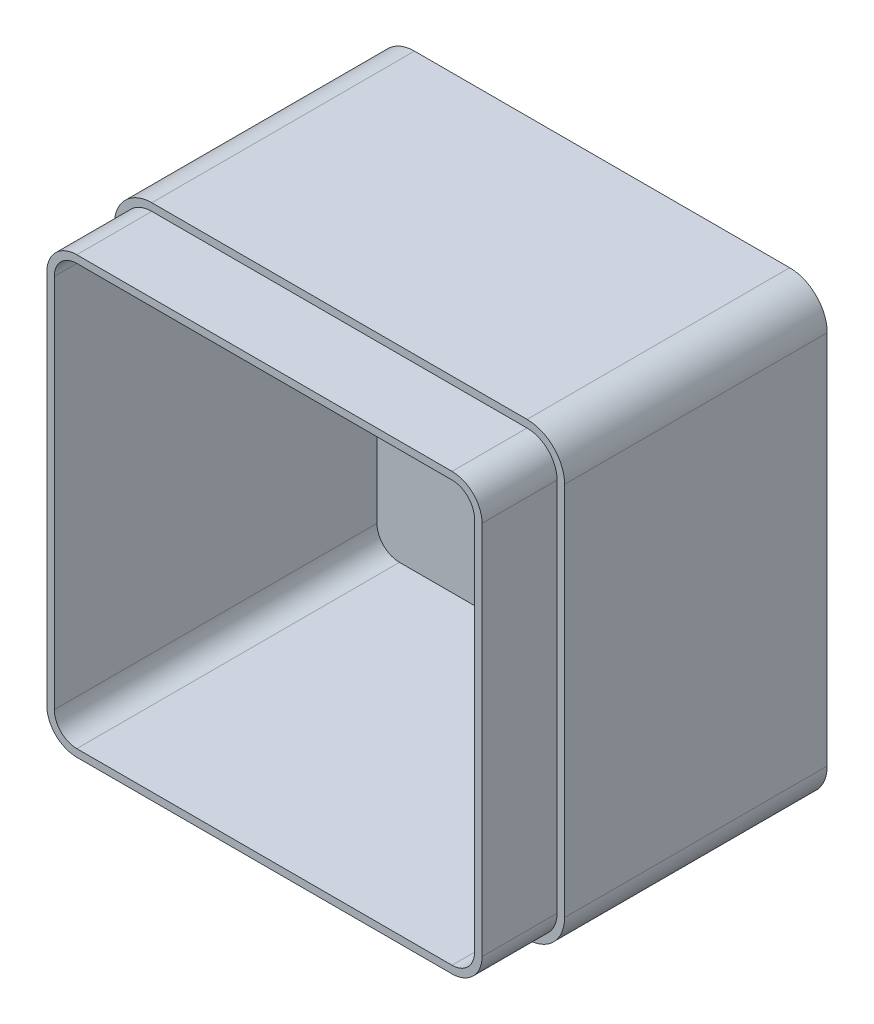
ISO-10303-21;
HEADER;
FILE_DESCRIPTION(('STEP AP214'),'2;1');
FILE_NAME('part.step','',(''),(''),'','','');
FILE_SCHEMA(('AUTOMOTIVE_DESIGN { 1 0 10303 214 1 1 1 1 }'));
ENDSEC;
DATA;
#1=APPLICATION_CONTEXT('core data for automotive mechanical design processes');
#2=APPLICATION_PROTOCOL_DEFINITION('international standard','automotive_design',2000,#1);
#3=PRODUCT_CONTEXT('',#1,'mechanical');
#4=PRODUCT('Part','Part','',(#3));
#5=PRODUCT_RELATED_PRODUCT_CATEGORY('part','',(#4));
#6=PRODUCT_DEFINITION_FORMATION('','',#4);
#7=PRODUCT_DEFINITION_CONTEXT('part definition',#1,'design');
#8=PRODUCT_DEFINITION('design','',#6,#7);
#9=PRODUCT_DEFINITION_SHAPE('','',#8);
#10=(LENGTH_UNIT() NAMED_UNIT(*) SI_UNIT(.MILLI.,.METRE.));
#11=(NAMED_UNIT(*) PLANE_ANGLE_UNIT() SI_UNIT($,.RADIAN.));
#12=(NAMED_UNIT(*) SI_UNIT($,.STERADIAN.) SOLID_ANGLE_UNIT());
#13=UNCERTAINTY_MEASURE_WITH_UNIT(LENGTH_MEASURE(1.E-05),#10,'distance_accuracy_value','');
#14=(GEOMETRIC_REPRESENTATION_CONTEXT(3) GLOBAL_UNCERTAINTY_ASSIGNED_CONTEXT((#13)) GLOBAL_UNIT_ASSIGNED_CONTEXT((#10,
#11,#12)) REPRESENTATION_CONTEXT('',''));
#15=CARTESIAN_POINT('',(0.,0.,0.));
#16=DIRECTION('',(0.,0.,1.));
#17=DIRECTION('',(1.,0.,0.));
#18=AXIS2_PLACEMENT_3D('',#15,#16,#17);
#19=CARTESIAN_POINT('',(0.,0.,90.));
#20=DIRECTION('',(0.,0.,-1.));
#21=DIRECTION('',(-1.,0.,0.));
#22=AXIS2_PLACEMENT_3D('',#19,#20,#21);
#23=PLANE('',#22);
#24=DIRECTION('',(0.,-1.,0.));
#25=VECTOR('',#24,1.);
#26=CARTESIAN_POINT('',(4.,0.,90.));
#27=LINE('',#26,#25);
#28=CARTESIAN_POINT('',(4.,110.,90.));
#29=VERTEX_POINT('',#28);
#30=CARTESIAN_POINT('',(4.,9.99999999999999,90.));
#31=VERTEX_POINT('',#30);
#32=EDGE_CURVE('E368',#29,#31,#27,.T.);
#33=ORIENTED_EDGE('',*,*,#32,.F.);
#34=CARTESIAN_POINT('',(9.99999999999999,110.,90.));
#35=DIRECTION('',(0.,0.,-1.));
#36=DIRECTION('',(-1.,0.,0.));
#37=AXIS2_PLACEMENT_3D('',#34,#35,#36);
#38=CIRCLE('',#37,6.);
#39=CARTESIAN_POINT('',(9.99999999999999,116.,90.));
#40=VERTEX_POINT('',#39);
#41=EDGE_CURVE('E414',#40,#29,#38,.F.);
#42=ORIENTED_EDGE('',*,*,#41,.F.);
#43=DIRECTION('',(-1.,0.,0.));
#44=VECTOR('',#43,1.);
#45=CARTESIAN_POINT('',(0.,116.,90.));
#46=LINE('',#45,#44);
#47=CARTESIAN_POINT('',(110.,116.,90.));
#48=VERTEX_POINT('',#47);
#49=EDGE_CURVE('E383',#48,#40,#46,.T.);
#50=ORIENTED_EDGE('',*,*,#49,.F.);
#51=CARTESIAN_POINT('',(110.,110.,90.));
#52=DIRECTION('',(0.,0.,-1.));
#53=DIRECTION('',(-1.,0.,0.));
#54=AXIS2_PLACEMENT_3D('',#51,#52,#53);
#55=CIRCLE('',#54,6.);
#56=CARTESIAN_POINT('',(116.,110.,90.));
#57=VERTEX_POINT('',#56);
#58=EDGE_CURVE('E347',#57,#48,#55,.F.);
#59=ORIENTED_EDGE('',*,*,#58,.F.);
#60=DIRECTION('',(0.,1.,0.));
#61=VECTOR('',#60,1.);
#62=CARTESIAN_POINT('',(116.,0.,90.));
#63=LINE('',#62,#61);
#64=CARTESIAN_POINT('',(116.,9.99999999999999,90.));
#65=VERTEX_POINT('',#64);
#66=EDGE_CURVE('E411',#65,#57,#63,.T.);
#67=ORIENTED_EDGE('',*,*,#66,.F.);
#68=CARTESIAN_POINT('',(110.,10.,90.));
#69=DIRECTION('',(0.,0.,-1.));
#70=DIRECTION('',(-1.,0.,0.));
#71=AXIS2_PLACEMENT_3D('',#68,#69,#70);
#72=CIRCLE('',#71,6.);
#73=CARTESIAN_POINT('',(110.,4.,90.));
#74=VERTEX_POINT('',#73);
#75=EDGE_CURVE('E407',#74,#65,#72,.F.);
#76=ORIENTED_EDGE('',*,*,#75,.F.);
#77=DIRECTION('',(1.,0.,0.));
#78=VECTOR('',#77,1.);
#79=CARTESIAN_POINT('',(0.,4.,90.));
#80=LINE('',#79,#78);
#81=CARTESIAN_POINT('',(9.99999999999999,4.,90.));
#82=VERTEX_POINT('',#81);
#83=EDGE_CURVE('E404',#82,#74,#80,.T.);
#84=ORIENTED_EDGE('',*,*,#83,.F.);
#85=CARTESIAN_POINT('',(9.99999999999999,10.,90.));
#86=DIRECTION('',(0.,0.,-1.));
#87=DIRECTION('',(-1.,0.,0.));
#88=AXIS2_PLACEMENT_3D('',#85,#86,#87);
#89=CIRCLE('',#88,6.);
#90=EDGE_CURVE('E392',#31,#82,#89,.F.);
#91=ORIENTED_EDGE('',*,*,#90,.F.);
#92=EDGE_LOOP('',(#33,#42,#50,#59,#67,#76,#84,#91));
#93=FACE_BOUND('',#92,.T.);
#94=CARTESIAN_POINT('',(9.99999999999999,110.,90.));
#95=DIRECTION('',(0.,0.,1.));
#96=DIRECTION('',(1.,0.,0.));
#97=AXIS2_PLACEMENT_3D('',#94,#95,#96);
#98=CIRCLE('',#97,8.);
#99=CARTESIAN_POINT('',(9.99999999999999,118.,90.));
#100=VERTEX_POINT('',#99);
#101=CARTESIAN_POINT('',(2.,110.,90.));
#102=VERTEX_POINT('',#101);
#103=EDGE_CURVE('E275',#100,#102,#98,.T.);
#104=ORIENTED_EDGE('',*,*,#103,.T.);
#105=DIRECTION('',(0.,-1.,0.));
#106=VECTOR('',#105,1.);
#107=CARTESIAN_POINT('',(2.,110.,90.));
#108=LINE('',#107,#106);
#109=CARTESIAN_POINT('',(2.,9.99999999999999,90.));
#110=VERTEX_POINT('',#109);
#111=EDGE_CURVE('E223',#102,#110,#108,.T.);
#112=ORIENTED_EDGE('',*,*,#111,.T.);
#113=CARTESIAN_POINT('',(9.99999999999999,10.,90.));
#114=DIRECTION('',(0.,0.,1.));
#115=DIRECTION('',(1.,0.,0.));
#116=AXIS2_PLACEMENT_3D('',#113,#114,#115);
#117=CIRCLE('',#116,8.);
#118=CARTESIAN_POINT('',(9.99999999999999,2.,90.));
#119=VERTEX_POINT('',#118);
#120=EDGE_CURVE('E71',#110,#119,#117,.T.);
#121=ORIENTED_EDGE('',*,*,#120,.T.);
#122=DIRECTION('',(1.,0.,0.));
#123=VECTOR('',#122,1.);
#124=CARTESIAN_POINT('',(9.99999999999999,2.,90.));
#125=LINE('',#124,#123);
#126=CARTESIAN_POINT('',(110.,2.,90.));
#127=VERTEX_POINT('',#126);
#128=EDGE_CURVE('E282',#119,#127,#125,.T.);
#129=ORIENTED_EDGE('',*,*,#128,.T.);
#130=CARTESIAN_POINT('',(110.,10.,90.));
#131=DIRECTION('',(0.,0.,1.));
#132=DIRECTION('',(1.,0.,0.));
#133=AXIS2_PLACEMENT_3D('',#130,#131,#132);
#134=CIRCLE('',#133,7.99999999999999);
#135=CARTESIAN_POINT('',(118.,10.,90.));
#136=VERTEX_POINT('',#135);
#137=EDGE_CURVE('E286',#127,#136,#134,.T.);
#138=ORIENTED_EDGE('',*,*,#137,.T.);
#139=DIRECTION('',(0.,1.,0.));
#140=VECTOR('',#139,1.);
#141=CARTESIAN_POINT('',(118.,9.99999999999999,90.));
#142=LINE('',#141,#140);
#143=CARTESIAN_POINT('',(118.,110.,90.));
#144=VERTEX_POINT('',#143);
#145=EDGE_CURVE('E290',#136,#144,#142,.T.);
#146=ORIENTED_EDGE('',*,*,#145,.T.);
#147=CARTESIAN_POINT('',(110.,110.,90.));
#148=DIRECTION('',(0.,0.,1.));
#149=DIRECTION('',(1.,0.,0.));
#150=AXIS2_PLACEMENT_3D('',#147,#148,#149);
#151=CIRCLE('',#150,7.99999999999999);
#152=CARTESIAN_POINT('',(110.,118.,90.));
#153=VERTEX_POINT('',#152);
#154=EDGE_CURVE('E252',#144,#153,#151,.T.);
#155=ORIENTED_EDGE('',*,*,#154,.T.);
#156=DIRECTION('',(-1.,0.,0.));
#157=VECTOR('',#156,1.);
#158=CARTESIAN_POINT('',(110.,118.,90.));
#159=LINE('',#158,#157);
#160=EDGE_CURVE('E246',#153,#100,#159,.T.);
#161=ORIENTED_EDGE('',*,*,#160,.T.);
#162=EDGE_LOOP('',(#104,#112,#121,#129,#138,#146,#155,#161));
#163=FACE_BOUND('',#162,.T.);
#164=ADVANCED_FACE('F55',(#93,#163),#23,.F.);
#165=CARTESIAN_POINT('',(4.,0.,90.));
#166=DIRECTION('',(1.,0.,0.));
#167=DIRECTION('',(0.,0.,-1.));
#168=AXIS2_PLACEMENT_3D('',#165,#166,#167);
#169=PLANE('',#168);
#170=DIRECTION('',(0.,-1.,0.));
#171=VECTOR('',#170,1.);
#172=CARTESIAN_POINT('',(4.,0.,4.));
#173=LINE('',#172,#171);
#174=CARTESIAN_POINT('',(4.,110.,4.));
#175=VERTEX_POINT('',#174);
#176=CARTESIAN_POINT('',(4.,9.99999999999999,4.));
#177=VERTEX_POINT('',#176);
#178=EDGE_CURVE('E339',#175,#177,#173,.T.);
#179=ORIENTED_EDGE('',*,*,#178,.F.);
#180=DIRECTION('',(0.,0.,-1.));
#181=VECTOR('',#180,1.);
#182=CARTESIAN_POINT('',(4.,110.,90.));
#183=LINE('',#182,#181);
#184=EDGE_CURVE('E348',#29,#175,#183,.T.);
#185=ORIENTED_EDGE('',*,*,#184,.F.);
#186=ORIENTED_EDGE('',*,*,#32,.T.);
#187=DIRECTION('',(0.,0.,-1.));
#188=VECTOR('',#187,1.);
#189=CARTESIAN_POINT('',(4.,9.99999999999999,90.));
#190=LINE('',#189,#188);
#191=EDGE_CURVE('E344',#177,#31,#190,.F.);
#192=ORIENTED_EDGE('',*,*,#191,.F.);
#193=EDGE_LOOP('',(#179,#185,#186,#192));
#194=FACE_BOUND('',#193,.T.);
#195=ADVANCED_FACE('F526',(#194),#169,.T.);
#196=CARTESIAN_POINT('',(0.,4.,90.));
#197=DIRECTION('',(0.,1.,0.));
#198=DIRECTION('',(0.,0.,1.));
#199=AXIS2_PLACEMENT_3D('',#196,#197,#198);
#200=PLANE('',#199);
#201=ORIENTED_EDGE('',*,*,#83,.T.);
#202=DIRECTION('',(0.,0.,1.));
#203=VECTOR('',#202,1.);
#204=CARTESIAN_POINT('',(110.,4.,90.));
#205=LINE('',#204,#203);
#206=CARTESIAN_POINT('',(110.,4.,4.));
#207=VERTEX_POINT('',#206);
#208=EDGE_CURVE('E380',#207,#74,#205,.T.);
#209=ORIENTED_EDGE('',*,*,#208,.F.);
#210=DIRECTION('',(1.,0.,0.));
#211=VECTOR('',#210,1.);
#212=CARTESIAN_POINT('',(0.,4.,4.));
#213=LINE('',#212,#211);
#214=CARTESIAN_POINT('',(9.99999999999999,4.,4.));
#215=VERTEX_POINT('',#214);
#216=EDGE_CURVE('E343',#215,#207,#213,.T.);
#217=ORIENTED_EDGE('',*,*,#216,.F.);
#218=DIRECTION('',(0.,0.,1.));
#219=VECTOR('',#218,1.);
#220=CARTESIAN_POINT('',(9.99999999999999,4.,90.));
#221=LINE('',#220,#219);
#222=EDGE_CURVE('E371',#82,#215,#221,.F.);
#223=ORIENTED_EDGE('',*,*,#222,.F.);
#224=EDGE_LOOP('',(#201,#209,#217,#223));
#225=FACE_BOUND('',#224,.T.);
#226=ADVANCED_FACE('F532',(#225),#200,.T.);
#227=CARTESIAN_POINT('',(116.,0.,90.));
#228=DIRECTION('',(-1.,0.,0.));
#229=DIRECTION('',(0.,0.,1.));
#230=AXIS2_PLACEMENT_3D('',#227,#228,#229);
#231=PLANE('',#230);
#232=ORIENTED_EDGE('',*,*,#66,.T.);
#233=DIRECTION('',(0.,0.,1.));
#234=VECTOR('',#233,1.);
#235=CARTESIAN_POINT('',(116.,110.,90.));
#236=LINE('',#235,#234);
#237=CARTESIAN_POINT('',(116.,110.,4.));
#238=VERTEX_POINT('',#237);
#239=EDGE_CURVE('E389',#238,#57,#236,.T.);
#240=ORIENTED_EDGE('',*,*,#239,.F.);
#241=DIRECTION('',(0.,1.,0.));
#242=VECTOR('',#241,1.);
#243=CARTESIAN_POINT('',(116.,0.,4.));
#244=LINE('',#243,#242);
#245=CARTESIAN_POINT('',(116.,9.99999999999999,4.));
#246=VERTEX_POINT('',#245);
#247=EDGE_CURVE('E356',#246,#238,#244,.T.);
#248=ORIENTED_EDGE('',*,*,#247,.F.);
#249=DIRECTION('',(0.,0.,1.));
#250=VECTOR('',#249,1.);
#251=CARTESIAN_POINT('',(116.,9.99999999999999,90.));
#252=LINE('',#251,#250);
#253=EDGE_CURVE('E384',#65,#246,#252,.F.);
#254=ORIENTED_EDGE('',*,*,#253,.F.);
#255=EDGE_LOOP('',(#232,#240,#248,#254));
#256=FACE_BOUND('',#255,.T.);
#257=ADVANCED_FACE('F629',(#256),#231,.T.);
#258=CARTESIAN_POINT('',(0.,116.,90.));
#259=DIRECTION('',(0.,-1.,0.));
#260=DIRECTION('',(0.,0.,-1.));
#261=AXIS2_PLACEMENT_3D('',#258,#259,#260);
#262=PLANE('',#261);
#263=DIRECTION('',(-1.,0.,0.));
#264=VECTOR('',#263,1.);
#265=CARTESIAN_POINT('',(0.,116.,4.));
#266=LINE('',#265,#264);
#267=CARTESIAN_POINT('',(110.,116.,4.));
#268=VERTEX_POINT('',#267);
#269=CARTESIAN_POINT('',(9.99999999999999,116.,4.));
#270=VERTEX_POINT('',#269);
#271=EDGE_CURVE('E364',#268,#270,#266,.T.);
#272=ORIENTED_EDGE('',*,*,#271,.F.);
#273=DIRECTION('',(0.,0.,-1.));
#274=VECTOR('',#273,1.);
#275=CARTESIAN_POINT('',(110.,116.,90.));
#276=LINE('',#275,#274);
#277=EDGE_CURVE('E388',#48,#268,#276,.T.);
#278=ORIENTED_EDGE('',*,*,#277,.F.);
#279=ORIENTED_EDGE('',*,*,#49,.T.);
#280=DIRECTION('',(0.,0.,-1.));
#281=VECTOR('',#280,1.);
#282=CARTESIAN_POINT('',(9.99999999999999,116.,90.));
#283=LINE('',#282,#281);
#284=EDGE_CURVE('E396',#270,#40,#283,.F.);
#285=ORIENTED_EDGE('',*,*,#284,.F.);
#286=EDGE_LOOP('',(#272,#278,#279,#285));
#287=FACE_BOUND('',#286,.T.);
#288=ADVANCED_FACE('F633',(#287),#262,.T.);
#289=CARTESIAN_POINT('',(0.,0.,4.));
#290=DIRECTION('',(0.,0.,-1.));
#291=DIRECTION('',(-1.,0.,0.));
#292=AXIS2_PLACEMENT_3D('',#289,#290,#291);
#293=PLANE('',#292);
#294=ORIENTED_EDGE('',*,*,#216,.T.);
#295=CARTESIAN_POINT('',(110.,10.,4.));
#296=DIRECTION('',(0.,0.,-1.));
#297=DIRECTION('',(-1.,0.,0.));
#298=AXIS2_PLACEMENT_3D('',#295,#296,#297);
#299=CIRCLE('',#298,6.);
#300=EDGE_CURVE('E359',#246,#207,#299,.T.);
#301=ORIENTED_EDGE('',*,*,#300,.F.);
#302=ORIENTED_EDGE('',*,*,#247,.T.);
#303=CARTESIAN_POINT('',(110.,110.,4.));
#304=DIRECTION('',(0.,0.,-1.));
#305=DIRECTION('',(-1.,0.,0.));
#306=AXIS2_PLACEMENT_3D('',#303,#304,#305);
#307=CIRCLE('',#306,6.);
#308=EDGE_CURVE('E363',#268,#238,#307,.T.);
#309=ORIENTED_EDGE('',*,*,#308,.F.);
#310=ORIENTED_EDGE('',*,*,#271,.T.);
#311=CARTESIAN_POINT('',(9.99999999999999,110.,4.));
#312=DIRECTION('',(0.,0.,-1.));
#313=DIRECTION('',(-1.,0.,0.));
#314=AXIS2_PLACEMENT_3D('',#311,#312,#313);
#315=CIRCLE('',#314,6.);
#316=EDGE_CURVE('E360',#175,#270,#315,.T.);
#317=ORIENTED_EDGE('',*,*,#316,.F.);
#318=ORIENTED_EDGE('',*,*,#178,.T.);
#319=CARTESIAN_POINT('',(9.99999999999999,10.,4.));
#320=DIRECTION('',(0.,0.,-1.));
#321=DIRECTION('',(-1.,0.,0.));
#322=AXIS2_PLACEMENT_3D('',#319,#320,#321);
#323=CIRCLE('',#322,6.);
#324=EDGE_CURVE('E352',#215,#177,#323,.T.);
#325=ORIENTED_EDGE('',*,*,#324,.F.);
#326=EDGE_LOOP('',(#294,#301,#302,#309,#310,#317,#318,#325));
#327=FACE_BOUND('',#326,.T.);
#328=ADVANCED_FACE('F637',(#327),#293,.F.);
#329=CARTESIAN_POINT('',(9.99999999999999,10.,90.));
#330=DIRECTION('',(0.,0.,-1.));
#331=DIRECTION('',(-1.,0.,0.));
#332=AXIS2_PLACEMENT_3D('',#329,#330,#331);
#333=CYLINDRICAL_SURFACE('',#332,6.);
#334=ORIENTED_EDGE('',*,*,#90,.T.);
#335=ORIENTED_EDGE('',*,*,#222,.T.);
#336=ORIENTED_EDGE('',*,*,#324,.T.);
#337=ORIENTED_EDGE('',*,*,#191,.T.);
#338=EDGE_LOOP('',(#334,#335,#336,#337));
#339=FACE_BOUND('',#338,.T.);
#340=ADVANCED_FACE('F641',(#339),#333,.F.);
#341=CARTESIAN_POINT('',(110.,10.,90.));
#342=DIRECTION('',(0.,0.,-1.));
#343=DIRECTION('',(-1.,0.,0.));
#344=AXIS2_PLACEMENT_3D('',#341,#342,#343);
#345=CYLINDRICAL_SURFACE('',#344,6.);
#346=ORIENTED_EDGE('',*,*,#75,.T.);
#347=ORIENTED_EDGE('',*,*,#253,.T.);
#348=ORIENTED_EDGE('',*,*,#300,.T.);
#349=ORIENTED_EDGE('',*,*,#208,.T.);
#350=EDGE_LOOP('',(#346,#347,#348,#349));
#351=FACE_BOUND('',#350,.T.);
#352=ADVANCED_FACE('F645',(#351),#345,.F.);
#353=CARTESIAN_POINT('',(9.99999999999999,110.,90.));
#354=DIRECTION('',(0.,0.,-1.));
#355=DIRECTION('',(-1.,0.,0.));
#356=AXIS2_PLACEMENT_3D('',#353,#354,#355);
#357=CYLINDRICAL_SURFACE('',#356,6.);
#358=ORIENTED_EDGE('',*,*,#41,.T.);
#359=ORIENTED_EDGE('',*,*,#184,.T.);
#360=ORIENTED_EDGE('',*,*,#316,.T.);
#361=ORIENTED_EDGE('',*,*,#284,.T.);
#362=EDGE_LOOP('',(#358,#359,#360,#361));
#363=FACE_BOUND('',#362,.T.);
#364=ADVANCED_FACE('F648',(#363),#357,.F.);
#365=CARTESIAN_POINT('',(110.,110.,90.));
#366=DIRECTION('',(0.,0.,-1.));
#367=DIRECTION('',(-1.,0.,0.));
#368=AXIS2_PLACEMENT_3D('',#365,#366,#367);
#369=CYLINDRICAL_SURFACE('',#368,6.);
#370=ORIENTED_EDGE('',*,*,#58,.T.);
#371=ORIENTED_EDGE('',*,*,#277,.T.);
#372=ORIENTED_EDGE('',*,*,#308,.T.);
#373=ORIENTED_EDGE('',*,*,#239,.T.);
#374=EDGE_LOOP('',(#370,#371,#372,#373));
#375=FACE_BOUND('',#374,.T.);
#376=ADVANCED_FACE('F539',(#375),#369,.F.);
#377=CARTESIAN_POINT('',(9.99999999999999,110.,70.));
#378=DIRECTION('',(0.,0.,1.));
#379=DIRECTION('',(1.,0.,0.));
#380=AXIS2_PLACEMENT_3D('',#377,#378,#379);
#381=PLANE('',#380);
#382=DIRECTION('',(-1.,0.,0.));
#383=VECTOR('',#382,1.);
#384=CARTESIAN_POINT('',(110.,118.,70.));
#385=LINE('',#384,#383);
#386=CARTESIAN_POINT('',(110.,118.,70.));
#387=VERTEX_POINT('',#386);
#388=CARTESIAN_POINT('',(9.99999999999999,118.,70.));
#389=VERTEX_POINT('',#388);
#390=EDGE_CURVE('E230',#387,#389,#385,.T.);
#391=ORIENTED_EDGE('',*,*,#390,.F.);
#392=CARTESIAN_POINT('',(110.,110.,70.));
#393=DIRECTION('',(0.,0.,1.));
#394=DIRECTION('',(1.,0.,0.));
#395=AXIS2_PLACEMENT_3D('',#392,#393,#394);
#396=CIRCLE('',#395,7.99999999999999);
#397=CARTESIAN_POINT('',(118.,110.,70.));
#398=VERTEX_POINT('',#397);
#399=EDGE_CURVE('E269',#398,#387,#396,.T.);
#400=ORIENTED_EDGE('',*,*,#399,.F.);
#401=DIRECTION('',(0.,1.,0.));
#402=VECTOR('',#401,1.);
#403=CARTESIAN_POINT('',(118.,9.99999999999999,70.));
#404=LINE('',#403,#402);
#405=CARTESIAN_POINT('',(118.,10.,70.));
#406=VERTEX_POINT('',#405);
#407=EDGE_CURVE('E265',#406,#398,#404,.T.);
#408=ORIENTED_EDGE('',*,*,#407,.F.);
#409=CARTESIAN_POINT('',(110.,10.,70.));
#410=DIRECTION('',(0.,0.,1.));
#411=DIRECTION('',(1.,0.,0.));
#412=AXIS2_PLACEMENT_3D('',#409,#410,#411);
#413=CIRCLE('',#412,7.99999999999999);
#414=CARTESIAN_POINT('',(110.,2.,70.));
#415=VERTEX_POINT('',#414);
#416=EDGE_CURVE('E261',#415,#406,#413,.T.);
#417=ORIENTED_EDGE('',*,*,#416,.F.);
#418=DIRECTION('',(1.,0.,0.));
#419=VECTOR('',#418,1.);
#420=CARTESIAN_POINT('',(9.99999999999999,2.,70.));
#421=LINE('',#420,#419);
#422=CARTESIAN_POINT('',(9.99999999999999,2.,70.));
#423=VERTEX_POINT('',#422);
#424=EDGE_CURVE('E257',#423,#415,#421,.T.);
#425=ORIENTED_EDGE('',*,*,#424,.F.);
#426=CARTESIAN_POINT('',(9.99999999999999,10.,70.));
#427=DIRECTION('',(0.,0.,1.));
#428=DIRECTION('',(1.,0.,0.));
#429=AXIS2_PLACEMENT_3D('',#426,#427,#428);
#430=CIRCLE('',#429,8.);
#431=CARTESIAN_POINT('',(2.,9.99999999999999,70.));
#432=VERTEX_POINT('',#431);
#433=EDGE_CURVE('E240',#432,#423,#430,.T.);
#434=ORIENTED_EDGE('',*,*,#433,.F.);
#435=DIRECTION('',(0.,-1.,0.));
#436=VECTOR('',#435,1.);
#437=CARTESIAN_POINT('',(2.,110.,70.));
#438=LINE('',#437,#436);
#439=CARTESIAN_POINT('',(2.,110.,70.));
#440=VERTEX_POINT('',#439);
#441=EDGE_CURVE('E221',#440,#432,#438,.T.);
#442=ORIENTED_EDGE('',*,*,#441,.F.);
#443=CARTESIAN_POINT('',(9.99999999999999,110.,70.));
#444=DIRECTION('',(0.,0.,1.));
#445=DIRECTION('',(1.,0.,0.));
#446=AXIS2_PLACEMENT_3D('',#443,#444,#445);
#447=CIRCLE('',#446,8.);
#448=EDGE_CURVE('E236',#389,#440,#447,.T.);
#449=ORIENTED_EDGE('',*,*,#448,.F.);
#450=EDGE_LOOP('',(#391,#400,#408,#417,#425,#434,#442,#449));
#451=FACE_BOUND('',#450,.T.);
#452=CARTESIAN_POINT('',(9.99999999999999,110.,70.));
#453=DIRECTION('',(0.,0.,1.));
#454=DIRECTION('',(1.,0.,0.));
#455=AXIS2_PLACEMENT_3D('',#452,#453,#454);
#456=CIRCLE('',#455,10.);
#457=CARTESIAN_POINT('',(9.99999999999999,120.,70.));
#458=VERTEX_POINT('',#457);
#459=CARTESIAN_POINT('',(0.,110.,70.));
#460=VERTEX_POINT('',#459);
#461=EDGE_CURVE('E299',#458,#460,#456,.T.);
#462=ORIENTED_EDGE('',*,*,#461,.T.);
#463=DIRECTION('',(0.,-1.,0.));
#464=VECTOR('',#463,1.);
#465=CARTESIAN_POINT('',(0.,110.,70.));
#466=LINE('',#465,#464);
#467=CARTESIAN_POINT('',(0.,10.,70.));
#468=VERTEX_POINT('',#467);
#469=EDGE_CURVE('E319',#460,#468,#466,.T.);
#470=ORIENTED_EDGE('',*,*,#469,.T.);
#471=CARTESIAN_POINT('',(9.99999999999999,10.,70.));
#472=DIRECTION('',(0.,0.,1.));
#473=DIRECTION('',(1.,0.,0.));
#474=AXIS2_PLACEMENT_3D('',#471,#472,#473);
#475=CIRCLE('',#474,10.);
#476=CARTESIAN_POINT('',(9.99999999999999,0.,70.));
#477=VERTEX_POINT('',#476);
#478=EDGE_CURVE('E322',#468,#477,#475,.T.);
#479=ORIENTED_EDGE('',*,*,#478,.T.);
#480=DIRECTION('',(1.,0.,0.));
#481=VECTOR('',#480,1.);
#482=CARTESIAN_POINT('',(9.99999999999999,0.,70.));
#483=LINE('',#482,#481);
#484=CARTESIAN_POINT('',(110.,0.,70.));
#485=VERTEX_POINT('',#484);
#486=EDGE_CURVE('E325',#477,#485,#483,.T.);
#487=ORIENTED_EDGE('',*,*,#486,.T.);
#488=CARTESIAN_POINT('',(110.,10.,70.));
#489=DIRECTION('',(0.,0.,1.));
#490=DIRECTION('',(1.,0.,0.));
#491=AXIS2_PLACEMENT_3D('',#488,#489,#490);
#492=CIRCLE('',#491,9.99999999999999);
#493=CARTESIAN_POINT('',(120.,10.,70.));
#494=VERTEX_POINT('',#493);
#495=EDGE_CURVE('E328',#485,#494,#492,.T.);
#496=ORIENTED_EDGE('',*,*,#495,.T.);
#497=DIRECTION('',(0.,1.,0.));
#498=VECTOR('',#497,1.);
#499=CARTESIAN_POINT('',(120.,10.,70.));
#500=LINE('',#499,#498);
#501=CARTESIAN_POINT('',(120.,110.,70.));
#502=VERTEX_POINT('',#501);
#503=EDGE_CURVE('E79',#494,#502,#500,.T.);
#504=ORIENTED_EDGE('',*,*,#503,.T.);
#505=CARTESIAN_POINT('',(110.,110.,70.));
#506=DIRECTION('',(0.,0.,1.));
#507=DIRECTION('',(1.,0.,0.));
#508=AXIS2_PLACEMENT_3D('',#505,#506,#507);
#509=CIRCLE('',#508,9.99999999999999);
#510=CARTESIAN_POINT('',(110.,120.,70.));
#511=VERTEX_POINT('',#510);
#512=EDGE_CURVE('E333',#502,#511,#509,.T.);
#513=ORIENTED_EDGE('',*,*,#512,.T.);
#514=DIRECTION('',(-1.,0.,0.));
#515=VECTOR('',#514,1.);
#516=CARTESIAN_POINT('',(110.,120.,70.));
#517=LINE('',#516,#515);
#518=EDGE_CURVE('E336',#511,#458,#517,.T.);
#519=ORIENTED_EDGE('',*,*,#518,.T.);
#520=EDGE_LOOP('',(#462,#470,#479,#487,#496,#504,#513,#519));
#521=FACE_BOUND('',#520,.T.);
#522=ADVANCED_FACE('F235',(#451,#521),#381,.T.);
#523=CARTESIAN_POINT('',(9.99999999999999,110.,70.));
#524=DIRECTION('',(0.,0.,1.));
#525=DIRECTION('',(1.,0.,0.));
#526=AXIS2_PLACEMENT_3D('',#523,#524,#525);
#527=CYLINDRICAL_SURFACE('',#526,8.);
#528=ORIENTED_EDGE('',*,*,#103,.F.);
#529=DIRECTION('',(0.,0.,1.));
#530=VECTOR('',#529,1.);
#531=CARTESIAN_POINT('',(9.99999999999999,118.,70.));
#532=LINE('',#531,#530);
#533=EDGE_CURVE('E244',#389,#100,#532,.T.);
#534=ORIENTED_EDGE('',*,*,#533,.F.);
#535=ORIENTED_EDGE('',*,*,#448,.T.);
#536=DIRECTION('',(0.,0.,1.));
#537=VECTOR('',#536,1.);
#538=CARTESIAN_POINT('',(2.,110.,70.));
#539=LINE('',#538,#537);
#540=EDGE_CURVE('E218',#440,#102,#539,.T.);
#541=ORIENTED_EDGE('',*,*,#540,.T.);
#542=EDGE_LOOP('',(#528,#534,#535,#541));
#543=FACE_BOUND('',#542,.T.);
#544=ADVANCED_FACE('F243',(#543),#527,.T.);
#545=CARTESIAN_POINT('',(110.,118.,70.));
#546=DIRECTION('',(0.,1.,0.));
#547=DIRECTION('',(0.,0.,1.));
#548=AXIS2_PLACEMENT_3D('',#545,#546,#547);
#549=PLANE('',#548);
#550=ORIENTED_EDGE('',*,*,#160,.F.);
#551=DIRECTION('',(0.,0.,1.));
#552=VECTOR('',#551,1.);
#553=CARTESIAN_POINT('',(110.,118.,70.));
#554=LINE('',#553,#552);
#555=EDGE_CURVE('E300',#387,#153,#554,.T.);
#556=ORIENTED_EDGE('',*,*,#555,.F.);
#557=ORIENTED_EDGE('',*,*,#390,.T.);
#558=ORIENTED_EDGE('',*,*,#533,.T.);
#559=EDGE_LOOP('',(#550,#556,#557,#558));
#560=FACE_BOUND('',#559,.T.);
#561=ADVANCED_FACE('F571',(#560),#549,.T.);
#562=CARTESIAN_POINT('',(110.,110.,70.));
#563=DIRECTION('',(0.,0.,1.));
#564=DIRECTION('',(1.,0.,0.));
#565=AXIS2_PLACEMENT_3D('',#562,#563,#564);
#566=CYLINDRICAL_SURFACE('',#565,7.99999999999999);
#567=ORIENTED_EDGE('',*,*,#154,.F.);
#568=DIRECTION('',(0.,0.,1.));
#569=VECTOR('',#568,1.);
#570=CARTESIAN_POINT('',(118.,110.,70.));
#571=LINE('',#570,#569);
#572=EDGE_CURVE('E303',#398,#144,#571,.T.);
#573=ORIENTED_EDGE('',*,*,#572,.F.);
#574=ORIENTED_EDGE('',*,*,#399,.T.);
#575=ORIENTED_EDGE('',*,*,#555,.T.);
#576=EDGE_LOOP('',(#567,#573,#574,#575));
#577=FACE_BOUND('',#576,.T.);
#578=ADVANCED_FACE('F578',(#577),#566,.T.);
#579=CARTESIAN_POINT('',(118.,9.99999999999999,70.));
#580=DIRECTION('',(1.,0.,0.));
#581=DIRECTION('',(0.,0.,-1.));
#582=AXIS2_PLACEMENT_3D('',#579,#580,#581);
#583=PLANE('',#582);
#584=ORIENTED_EDGE('',*,*,#145,.F.);
#585=DIRECTION('',(0.,0.,1.));
#586=VECTOR('',#585,1.);
#587=CARTESIAN_POINT('',(118.,10.,70.));
#588=LINE('',#587,#586);
#589=EDGE_CURVE('E306',#406,#136,#588,.T.);
#590=ORIENTED_EDGE('',*,*,#589,.F.);
#591=ORIENTED_EDGE('',*,*,#407,.T.);
#592=ORIENTED_EDGE('',*,*,#572,.T.);
#593=EDGE_LOOP('',(#584,#590,#591,#592));
#594=FACE_BOUND('',#593,.T.);
#595=ADVANCED_FACE('F586',(#594),#583,.T.);
#596=CARTESIAN_POINT('',(110.,10.,70.));
#597=DIRECTION('',(0.,0.,1.));
#598=DIRECTION('',(1.,0.,0.));
#599=AXIS2_PLACEMENT_3D('',#596,#597,#598);
#600=CYLINDRICAL_SURFACE('',#599,7.99999999999999);
#601=ORIENTED_EDGE('',*,*,#137,.F.);
#602=DIRECTION('',(0.,0.,1.));
#603=VECTOR('',#602,1.);
#604=CARTESIAN_POINT('',(110.,2.,70.));
#605=LINE('',#604,#603);
#606=EDGE_CURVE('E309',#415,#127,#605,.T.);
#607=ORIENTED_EDGE('',*,*,#606,.F.);
#608=ORIENTED_EDGE('',*,*,#416,.T.);
#609=ORIENTED_EDGE('',*,*,#589,.T.);
#610=EDGE_LOOP('',(#601,#607,#608,#609));
#611=FACE_BOUND('',#610,.T.);
#612=ADVANCED_FACE('F594',(#611),#600,.T.);
#613=CARTESIAN_POINT('',(9.99999999999999,2.,70.));
#614=DIRECTION('',(0.,-1.,0.));
#615=DIRECTION('',(0.,0.,-1.));
#616=AXIS2_PLACEMENT_3D('',#613,#614,#615);
#617=PLANE('',#616);
#618=ORIENTED_EDGE('',*,*,#128,.F.);
#619=DIRECTION('',(0.,0.,1.));
#620=VECTOR('',#619,1.);
#621=CARTESIAN_POINT('',(9.99999999999999,2.,70.));
#622=LINE('',#621,#620);
#623=EDGE_CURVE('E312',#423,#119,#622,.T.);
#624=ORIENTED_EDGE('',*,*,#623,.F.);
#625=ORIENTED_EDGE('',*,*,#424,.T.);
#626=ORIENTED_EDGE('',*,*,#606,.T.);
#627=EDGE_LOOP('',(#618,#624,#625,#626));
#628=FACE_BOUND('',#627,.T.);
#629=ADVANCED_FACE('F602',(#628),#617,.T.);
#630=CARTESIAN_POINT('',(9.99999999999999,10.,70.));
#631=DIRECTION('',(0.,0.,1.));
#632=DIRECTION('',(1.,0.,0.));
#633=AXIS2_PLACEMENT_3D('',#630,#631,#632);
#634=CYLINDRICAL_SURFACE('',#633,8.);
#635=ORIENTED_EDGE('',*,*,#120,.F.);
#636=DIRECTION('',(0.,0.,1.));
#637=VECTOR('',#636,1.);
#638=CARTESIAN_POINT('',(2.,9.99999999999999,70.));
#639=LINE('',#638,#637);
#640=EDGE_CURVE('E229',#432,#110,#639,.T.);
#641=ORIENTED_EDGE('',*,*,#640,.F.);
#642=ORIENTED_EDGE('',*,*,#433,.T.);
#643=ORIENTED_EDGE('',*,*,#623,.T.);
#644=EDGE_LOOP('',(#635,#641,#642,#643));
#645=FACE_BOUND('',#644,.T.);
#646=ADVANCED_FACE('F610',(#645),#634,.T.);
#647=CARTESIAN_POINT('',(2.,110.,70.));
#648=DIRECTION('',(-1.,0.,0.));
#649=DIRECTION('',(0.,0.,1.));
#650=AXIS2_PLACEMENT_3D('',#647,#648,#649);
#651=PLANE('',#650);
#652=ORIENTED_EDGE('',*,*,#111,.F.);
#653=ORIENTED_EDGE('',*,*,#540,.F.);
#654=ORIENTED_EDGE('',*,*,#441,.T.);
#655=ORIENTED_EDGE('',*,*,#640,.T.);
#656=EDGE_LOOP('',(#652,#653,#654,#655));
#657=FACE_BOUND('',#656,.T.);
#658=ADVANCED_FACE('F220',(#657),#651,.T.);
#659=CARTESIAN_POINT('',(0.,0.,0.));
#660=DIRECTION('',(0.,0.,-1.));
#661=DIRECTION('',(-1.,0.,0.));
#662=AXIS2_PLACEMENT_3D('',#659,#660,#661);
#663=PLANE('',#662);
#664=DIRECTION('',(1.,0.,0.));
#665=VECTOR('',#664,1.);
#666=CARTESIAN_POINT('',(0.,0.,0.));
#667=LINE('',#666,#665);
#668=CARTESIAN_POINT('',(9.99999999999999,0.,0.));
#669=VERTEX_POINT('',#668);
#670=CARTESIAN_POINT('',(110.,0.,0.));
#671=VERTEX_POINT('',#670);
#672=EDGE_CURVE('E427',#669,#671,#667,.T.);
#673=ORIENTED_EDGE('',*,*,#672,.F.);
#674=CARTESIAN_POINT('',(9.99999999999999,10.,0.));
#675=DIRECTION('',(0.,0.,-1.));
#676=DIRECTION('',(-1.,0.,0.));
#677=AXIS2_PLACEMENT_3D('',#674,#675,#676);
#678=CIRCLE('',#677,10.);
#679=CARTESIAN_POINT('',(0.,10.,0.));
#680=VERTEX_POINT('',#679);
#681=EDGE_CURVE('E455',#669,#680,#678,.T.);
#682=ORIENTED_EDGE('',*,*,#681,.T.);
#683=DIRECTION('',(0.,-1.,0.));
#684=VECTOR('',#683,1.);
#685=CARTESIAN_POINT('',(0.,0.,0.));
#686=LINE('',#685,#684);
#687=CARTESIAN_POINT('',(0.,110.,0.));
#688=VERTEX_POINT('',#687);
#689=EDGE_CURVE('E400',#688,#680,#686,.T.);
#690=ORIENTED_EDGE('',*,*,#689,.F.);
#691=CARTESIAN_POINT('',(9.99999999999999,110.,0.));
#692=DIRECTION('',(0.,0.,-1.));
#693=DIRECTION('',(-1.,0.,0.));
#694=AXIS2_PLACEMENT_3D('',#691,#692,#693);
#695=CIRCLE('',#694,10.);
#696=CARTESIAN_POINT('',(9.99999999999999,120.,0.));
#697=VERTEX_POINT('',#696);
#698=EDGE_CURVE('E449',#688,#697,#695,.T.);
#699=ORIENTED_EDGE('',*,*,#698,.T.);
#700=DIRECTION('',(-1.,0.,0.));
#701=VECTOR('',#700,1.);
#702=CARTESIAN_POINT('',(0.,120.,0.));
#703=LINE('',#702,#701);
#704=CARTESIAN_POINT('',(110.,120.,0.));
#705=VERTEX_POINT('',#704);
#706=EDGE_CURVE('E435',#705,#697,#703,.T.);
#707=ORIENTED_EDGE('',*,*,#706,.F.);
#708=CARTESIAN_POINT('',(110.,110.,0.));
#709=DIRECTION('',(0.,0.,-1.));
#710=DIRECTION('',(-1.,0.,0.));
#711=AXIS2_PLACEMENT_3D('',#708,#709,#710);
#712=CIRCLE('',#711,10.);
#713=CARTESIAN_POINT('',(120.,110.,0.));
#714=VERTEX_POINT('',#713);
#715=EDGE_CURVE('E446',#705,#714,#712,.T.);
#716=ORIENTED_EDGE('',*,*,#715,.T.);
#717=DIRECTION('',(0.,1.,0.));
#718=VECTOR('',#717,1.);
#719=CARTESIAN_POINT('',(120.,0.,0.));
#720=LINE('',#719,#718);
#721=CARTESIAN_POINT('',(120.,10.,0.));
#722=VERTEX_POINT('',#721);
#723=EDGE_CURVE('E431',#722,#714,#720,.T.);
#724=ORIENTED_EDGE('',*,*,#723,.F.);
#725=CARTESIAN_POINT('',(110.,10.,0.));
#726=DIRECTION('',(0.,0.,-1.));
#727=DIRECTION('',(-1.,0.,0.));
#728=AXIS2_PLACEMENT_3D('',#725,#726,#727);
#729=CIRCLE('',#728,10.);
#730=EDGE_CURVE('E452',#722,#671,#729,.T.);
#731=ORIENTED_EDGE('',*,*,#730,.T.);
#732=EDGE_LOOP('',(#673,#682,#690,#699,#707,#716,#724,#731));
#733=FACE_BOUND('',#732,.T.);
#734=ADVANCED_FACE('F486',(#733),#663,.T.);
#735=CARTESIAN_POINT('',(9.99999999999999,110.,90.));
#736=DIRECTION('',(0.,0.,-1.));
#737=DIRECTION('',(-1.,0.,0.));
#738=AXIS2_PLACEMENT_3D('',#735,#736,#737);
#739=CYLINDRICAL_SURFACE('',#738,10.);
#740=DIRECTION('',(0.,0.,-1.));
#741=VECTOR('',#740,1.);
#742=CARTESIAN_POINT('',(0.,110.,90.));
#743=LINE('',#742,#741);
#744=EDGE_CURVE('E458',#460,#688,#743,.T.);
#745=ORIENTED_EDGE('',*,*,#744,.F.);
#746=ORIENTED_EDGE('',*,*,#461,.F.);
#747=DIRECTION('',(0.,0.,-1.));
#748=VECTOR('',#747,1.);
#749=CARTESIAN_POINT('',(9.99999999999999,120.,90.));
#750=LINE('',#749,#748);
#751=EDGE_CURVE('E12',#697,#458,#750,.F.);
#752=ORIENTED_EDGE('',*,*,#751,.F.);
#753=ORIENTED_EDGE('',*,*,#698,.F.);
#754=EDGE_LOOP('',(#745,#746,#752,#753));
#755=FACE_BOUND('',#754,.T.);
#756=ADVANCED_FACE('F491',(#755),#739,.T.);
#757=CARTESIAN_POINT('',(110.,110.,90.));
#758=DIRECTION('',(0.,0.,-1.));
#759=DIRECTION('',(-1.,0.,0.));
#760=AXIS2_PLACEMENT_3D('',#757,#758,#759);
#761=CYLINDRICAL_SURFACE('',#760,10.);
#762=DIRECTION('',(0.,0.,-1.));
#763=VECTOR('',#762,1.);
#764=CARTESIAN_POINT('',(110.,120.,90.));
#765=LINE('',#764,#763);
#766=EDGE_CURVE('E64',#511,#705,#765,.T.);
#767=ORIENTED_EDGE('',*,*,#766,.F.);
#768=ORIENTED_EDGE('',*,*,#512,.F.);
#769=DIRECTION('',(0.,0.,-1.));
#770=VECTOR('',#769,1.);
#771=CARTESIAN_POINT('',(120.,110.,90.));
#772=LINE('',#771,#770);
#773=EDGE_CURVE('E465',#714,#502,#772,.F.);
#774=ORIENTED_EDGE('',*,*,#773,.F.);
#775=ORIENTED_EDGE('',*,*,#715,.F.);
#776=EDGE_LOOP('',(#767,#768,#774,#775));
#777=FACE_BOUND('',#776,.T.);
#778=ADVANCED_FACE('F57',(#777),#761,.T.);
#779=CARTESIAN_POINT('',(0.,120.,90.));
#780=DIRECTION('',(0.,-1.,0.));
#781=DIRECTION('',(0.,0.,-1.));
#782=AXIS2_PLACEMENT_3D('',#779,#780,#781);
#783=PLANE('',#782);
#784=ORIENTED_EDGE('',*,*,#518,.F.);
#785=ORIENTED_EDGE('',*,*,#766,.T.);
#786=ORIENTED_EDGE('',*,*,#706,.T.);
#787=ORIENTED_EDGE('',*,*,#751,.T.);
#788=EDGE_LOOP('',(#784,#785,#786,#787));
#789=FACE_BOUND('',#788,.T.);
#790=ADVANCED_FACE('F478',(#789),#783,.F.);
#791=CARTESIAN_POINT('',(110.,10.,90.));
#792=DIRECTION('',(0.,0.,-1.));
#793=DIRECTION('',(-1.,0.,0.));
#794=AXIS2_PLACEMENT_3D('',#791,#792,#793);
#795=CYLINDRICAL_SURFACE('',#794,10.);
#796=DIRECTION('',(0.,0.,-1.));
#797=VECTOR('',#796,1.);
#798=CARTESIAN_POINT('',(120.,10.,90.));
#799=LINE('',#798,#797);
#800=EDGE_CURVE('E469',#494,#722,#799,.T.);
#801=ORIENTED_EDGE('',*,*,#800,.F.);
#802=ORIENTED_EDGE('',*,*,#495,.F.);
#803=DIRECTION('',(0.,0.,-1.));
#804=VECTOR('',#803,1.);
#805=CARTESIAN_POINT('',(110.,0.,90.));
#806=LINE('',#805,#804);
#807=EDGE_CURVE('E439',#671,#485,#806,.F.);
#808=ORIENTED_EDGE('',*,*,#807,.F.);
#809=ORIENTED_EDGE('',*,*,#730,.F.);
#810=EDGE_LOOP('',(#801,#802,#808,#809));
#811=FACE_BOUND('',#810,.T.);
#812=ADVANCED_FACE('F510',(#811),#795,.T.);
#813=CARTESIAN_POINT('',(120.,0.,90.));
#814=DIRECTION('',(-1.,0.,0.));
#815=DIRECTION('',(0.,0.,1.));
#816=AXIS2_PLACEMENT_3D('',#813,#814,#815);
#817=PLANE('',#816);
#818=ORIENTED_EDGE('',*,*,#503,.F.);
#819=ORIENTED_EDGE('',*,*,#800,.T.);
#820=ORIENTED_EDGE('',*,*,#723,.T.);
#821=ORIENTED_EDGE('',*,*,#773,.T.);
#822=EDGE_LOOP('',(#818,#819,#820,#821));
#823=FACE_BOUND('',#822,.T.);
#824=ADVANCED_FACE('F512',(#823),#817,.F.);
#825=CARTESIAN_POINT('',(9.99999999999999,10.,90.));
#826=DIRECTION('',(0.,0.,-1.));
#827=DIRECTION('',(-1.,0.,0.));
#828=AXIS2_PLACEMENT_3D('',#825,#826,#827);
#829=CYLINDRICAL_SURFACE('',#828,10.);
#830=DIRECTION('',(0.,0.,-1.));
#831=VECTOR('',#830,1.);
#832=CARTESIAN_POINT('',(9.99999999999999,0.,90.));
#833=LINE('',#832,#831);
#834=EDGE_CURVE('E443',#477,#669,#833,.T.);
#835=ORIENTED_EDGE('',*,*,#834,.F.);
#836=ORIENTED_EDGE('',*,*,#478,.F.);
#837=DIRECTION('',(0.,0.,-1.));
#838=VECTOR('',#837,1.);
#839=CARTESIAN_POINT('',(0.,10.,90.));
#840=LINE('',#839,#838);
#841=EDGE_CURVE('E461',#680,#468,#840,.F.);
#842=ORIENTED_EDGE('',*,*,#841,.F.);
#843=ORIENTED_EDGE('',*,*,#681,.F.);
#844=EDGE_LOOP('',(#835,#836,#842,#843));
#845=FACE_BOUND('',#844,.T.);
#846=ADVANCED_FACE('F501',(#845),#829,.T.);
#847=CARTESIAN_POINT('',(0.,0.,90.));
#848=DIRECTION('',(0.,1.,0.));
#849=DIRECTION('',(0.,0.,1.));
#850=AXIS2_PLACEMENT_3D('',#847,#848,#849);
#851=PLANE('',#850);
#852=ORIENTED_EDGE('',*,*,#486,.F.);
#853=ORIENTED_EDGE('',*,*,#834,.T.);
#854=ORIENTED_EDGE('',*,*,#672,.T.);
#855=ORIENTED_EDGE('',*,*,#807,.T.);
#856=EDGE_LOOP('',(#852,#853,#854,#855));
#857=FACE_BOUND('',#856,.T.);
#858=ADVANCED_FACE('F505',(#857),#851,.F.);
#859=CARTESIAN_POINT('',(0.,0.,90.));
#860=DIRECTION('',(1.,0.,0.));
#861=DIRECTION('',(0.,0.,-1.));
#862=AXIS2_PLACEMENT_3D('',#859,#860,#861);
#863=PLANE('',#862);
#864=ORIENTED_EDGE('',*,*,#469,.F.);
#865=ORIENTED_EDGE('',*,*,#744,.T.);
#866=ORIENTED_EDGE('',*,*,#689,.T.);
#867=ORIENTED_EDGE('',*,*,#841,.T.);
#868=EDGE_LOOP('',(#864,#865,#866,#867));
#869=FACE_BOUND('',#868,.T.);
#870=ADVANCED_FACE('F496',(#869),#863,.F.);
#871=CLOSED_SHELL('',(#164,#195,#226,#257,#288,#328,#340,#352,#364,#376,#522,#544,#561,#578,
#595,#612,#629,#646,#658,#734,#756,#778,#790,#812,#824,#846,#858,#870));
#872=MANIFOLD_SOLID_BREP('B2',#871);
#873=ADVANCED_BREP_SHAPE_REPRESENTATION('',(#18,#872),#14);
#874=SHAPE_DEFINITION_REPRESENTATION(#9,#873);
ENDSEC;
END-ISO-10303-21;
